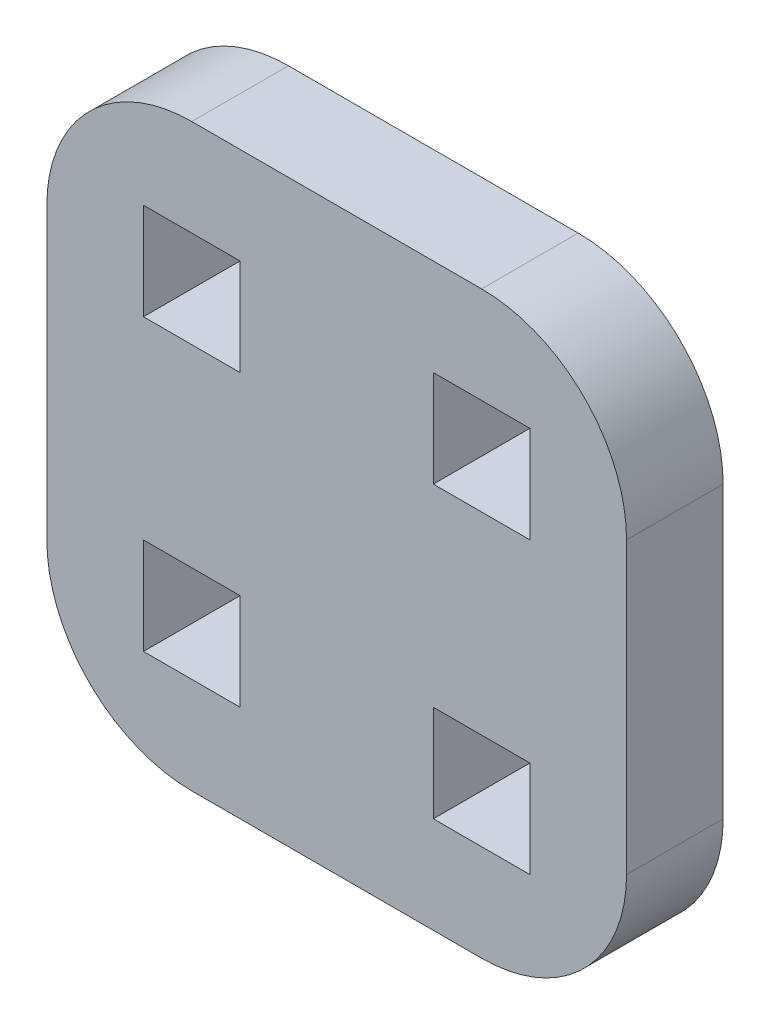
ISO-10303-21;
HEADER;
FILE_DESCRIPTION(('STEP AP214'),'2;1');
FILE_NAME('part.step','',(''),(''),'','','');
FILE_SCHEMA(('AUTOMOTIVE_DESIGN { 1 0 10303 214 1 1 1 1 }'));
ENDSEC;
DATA;
#1=APPLICATION_CONTEXT('core data for automotive mechanical design processes');
#2=APPLICATION_PROTOCOL_DEFINITION('international standard','automotive_design',2000,#1);
#3=PRODUCT_CONTEXT('',#1,'mechanical');
#4=PRODUCT('Part','Part','',(#3));
#5=PRODUCT_RELATED_PRODUCT_CATEGORY('part','',(#4));
#6=PRODUCT_DEFINITION_FORMATION('','',#4);
#7=PRODUCT_DEFINITION_CONTEXT('part definition',#1,'design');
#8=PRODUCT_DEFINITION('design','',#6,#7);
#9=PRODUCT_DEFINITION_SHAPE('','',#8);
#10=(LENGTH_UNIT() NAMED_UNIT(*) SI_UNIT(.MILLI.,.METRE.));
#11=(NAMED_UNIT(*) PLANE_ANGLE_UNIT() SI_UNIT($,.RADIAN.));
#12=(NAMED_UNIT(*) SI_UNIT($,.STERADIAN.) SOLID_ANGLE_UNIT());
#13=UNCERTAINTY_MEASURE_WITH_UNIT(LENGTH_MEASURE(1.E-05),#10,'distance_accuracy_value','');
#14=(GEOMETRIC_REPRESENTATION_CONTEXT(3) GLOBAL_UNCERTAINTY_ASSIGNED_CONTEXT((#13)) GLOBAL_UNIT_ASSIGNED_CONTEXT((#10,
#11,#12)) REPRESENTATION_CONTEXT('',''));
#15=CARTESIAN_POINT('',(0.,0.,0.));
#16=DIRECTION('',(0.,0.,1.));
#17=DIRECTION('',(1.,0.,0.));
#18=AXIS2_PLACEMENT_3D('',#15,#16,#17);
#19=CARTESIAN_POINT('',(18.821574141,295.0404470336,3.));
#20=DIRECTION('',(0.,0.,1.));
#21=DIRECTION('',(1.,0.,0.));
#22=AXIS2_PLACEMENT_3D('',#19,#20,#21);
#23=PLANE('',#22);
#24=DIRECTION('',(0.,-1.,0.));
#25=VECTOR('',#24,1.);
#26=CARTESIAN_POINT('',(8.321574141,287.5404470336,3.));
#27=LINE('',#26,#25);
#28=CARTESIAN_POINT('',(8.321574141,287.5404470336,3.));
#29=VERTEX_POINT('',#28);
#30=CARTESIAN_POINT('',(8.321574141,284.5404470336,3.));
#31=VERTEX_POINT('',#30);
#32=EDGE_CURVE('E232',#29,#31,#27,.T.);
#33=ORIENTED_EDGE('',*,*,#32,.F.);
#34=DIRECTION('',(-1.,0.,0.));
#35=VECTOR('',#34,1.);
#36=CARTESIAN_POINT('',(11.321574141,287.5404470336,3.));
#37=LINE('',#36,#35);
#38=CARTESIAN_POINT('',(11.321574141,287.5404470336,3.));
#39=VERTEX_POINT('',#38);
#40=EDGE_CURVE('E230',#39,#29,#37,.T.);
#41=ORIENTED_EDGE('',*,*,#40,.F.);
#42=DIRECTION('',(0.,1.,0.));
#43=VECTOR('',#42,1.);
#44=CARTESIAN_POINT('',(11.321574141,284.5404470336,3.));
#45=LINE('',#44,#43);
#46=CARTESIAN_POINT('',(11.321574141,284.5404470336,3.));
#47=VERTEX_POINT('',#46);
#48=EDGE_CURVE('E238',#47,#39,#45,.T.);
#49=ORIENTED_EDGE('',*,*,#48,.F.);
#50=DIRECTION('',(1.,0.,0.));
#51=VECTOR('',#50,1.);
#52=CARTESIAN_POINT('',(8.321574141,284.5404470336,3.));
#53=LINE('',#52,#51);
#54=EDGE_CURVE('E235',#31,#47,#53,.T.);
#55=ORIENTED_EDGE('',*,*,#54,.F.);
#56=EDGE_LOOP('',(#33,#41,#49,#55));
#57=FACE_BOUND('',#56,.T.);
#58=DIRECTION('',(0.,-1.,0.));
#59=VECTOR('',#58,1.);
#60=CARTESIAN_POINT('',(8.321574141,296.5404470336,3.));
#61=LINE('',#60,#59);
#62=CARTESIAN_POINT('',(8.321574141,296.5404470336,3.));
#63=VERTEX_POINT('',#62);
#64=CARTESIAN_POINT('',(8.321574141,293.5404470336,3.));
#65=VERTEX_POINT('',#64);
#66=EDGE_CURVE('E294',#63,#65,#61,.T.);
#67=ORIENTED_EDGE('',*,*,#66,.F.);
#68=DIRECTION('',(-1.,0.,0.));
#69=VECTOR('',#68,1.);
#70=CARTESIAN_POINT('',(11.321574141,296.5404470336,3.));
#71=LINE('',#70,#69);
#72=CARTESIAN_POINT('',(11.321574141,296.5404470336,3.));
#73=VERTEX_POINT('',#72);
#74=EDGE_CURVE('E292',#73,#63,#71,.T.);
#75=ORIENTED_EDGE('',*,*,#74,.F.);
#76=DIRECTION('',(0.,1.,0.));
#77=VECTOR('',#76,1.);
#78=CARTESIAN_POINT('',(11.321574141,293.5404470336,3.));
#79=LINE('',#78,#77);
#80=CARTESIAN_POINT('',(11.321574141,293.5404470336,3.));
#81=VERTEX_POINT('',#80);
#82=EDGE_CURVE('E300',#81,#73,#79,.T.);
#83=ORIENTED_EDGE('',*,*,#82,.F.);
#84=DIRECTION('',(1.,0.,0.));
#85=VECTOR('',#84,1.);
#86=CARTESIAN_POINT('',(8.321574141,293.5404470336,3.));
#87=LINE('',#86,#85);
#88=EDGE_CURVE('E297',#65,#81,#87,.T.);
#89=ORIENTED_EDGE('',*,*,#88,.F.);
#90=EDGE_LOOP('',(#67,#75,#83,#89));
#91=FACE_BOUND('',#90,.T.);
#92=CARTESIAN_POINT('',(18.821574141,295.0404470336,3.));
#93=DIRECTION('',(0.,0.,1.));
#94=DIRECTION('',(1.,0.,0.));
#95=AXIS2_PLACEMENT_3D('',#92,#93,#94);
#96=CIRCLE('',#95,4.5);
#97=CARTESIAN_POINT('',(23.321574141,295.0404470336,3.));
#98=VERTEX_POINT('',#97);
#99=CARTESIAN_POINT('',(18.821574141,299.5404470336,3.));
#100=VERTEX_POINT('',#99);
#101=EDGE_CURVE('E323',#98,#100,#96,.T.);
#102=ORIENTED_EDGE('',*,*,#101,.T.);
#103=DIRECTION('',(-1.,0.,0.));
#104=VECTOR('',#103,1.);
#105=CARTESIAN_POINT('',(9.821574141,299.5404470336,3.));
#106=LINE('',#105,#104);
#107=CARTESIAN_POINT('',(9.821574141,299.5404470336,3.));
#108=VERTEX_POINT('',#107);
#109=EDGE_CURVE('E326',#100,#108,#106,.T.);
#110=ORIENTED_EDGE('',*,*,#109,.T.);
#111=CARTESIAN_POINT('',(9.821574141,295.0404470336,3.));
#112=DIRECTION('',(0.,0.,1.));
#113=DIRECTION('',(1.,0.,0.));
#114=AXIS2_PLACEMENT_3D('',#111,#112,#113);
#115=CIRCLE('',#114,4.5);
#116=CARTESIAN_POINT('',(5.321574141,295.0404470336,3.));
#117=VERTEX_POINT('',#116);
#118=EDGE_CURVE('E329',#108,#117,#115,.T.);
#119=ORIENTED_EDGE('',*,*,#118,.T.);
#120=DIRECTION('',(0.,-1.,0.));
#121=VECTOR('',#120,1.);
#122=CARTESIAN_POINT('',(5.321574141,295.0404470336,3.));
#123=LINE('',#122,#121);
#124=CARTESIAN_POINT('',(5.321574141,286.0404470336,3.));
#125=VERTEX_POINT('',#124);
#126=EDGE_CURVE('E331',#117,#125,#123,.T.);
#127=ORIENTED_EDGE('',*,*,#126,.T.);
#128=CARTESIAN_POINT('',(9.821574141,286.0404470336,3.));
#129=DIRECTION('',(0.,0.,1.));
#130=DIRECTION('',(1.,0.,0.));
#131=AXIS2_PLACEMENT_3D('',#128,#129,#130);
#132=CIRCLE('',#131,4.5);
#133=CARTESIAN_POINT('',(9.821574141,281.5404470336,3.));
#134=VERTEX_POINT('',#133);
#135=EDGE_CURVE('E333',#125,#134,#132,.T.);
#136=ORIENTED_EDGE('',*,*,#135,.T.);
#137=DIRECTION('',(1.,0.,0.));
#138=VECTOR('',#137,1.);
#139=CARTESIAN_POINT('',(9.821574141,281.5404470336,3.));
#140=LINE('',#139,#138);
#141=CARTESIAN_POINT('',(18.821574141,281.5404470336,3.));
#142=VERTEX_POINT('',#141);
#143=EDGE_CURVE('E335',#134,#142,#140,.T.);
#144=ORIENTED_EDGE('',*,*,#143,.T.);
#145=CARTESIAN_POINT('',(18.821574141,286.0404470336,3.));
#146=DIRECTION('',(0.,0.,1.));
#147=DIRECTION('',(1.,0.,0.));
#148=AXIS2_PLACEMENT_3D('',#145,#146,#147);
#149=CIRCLE('',#148,4.5);
#150=CARTESIAN_POINT('',(23.321574141,286.0404470336,3.));
#151=VERTEX_POINT('',#150);
#152=EDGE_CURVE('E337',#142,#151,#149,.T.);
#153=ORIENTED_EDGE('',*,*,#152,.T.);
#154=DIRECTION('',(0.,1.,0.));
#155=VECTOR('',#154,1.);
#156=CARTESIAN_POINT('',(23.321574141,295.0404470336,3.));
#157=LINE('',#156,#155);
#158=EDGE_CURVE('E339',#151,#98,#157,.T.);
#159=ORIENTED_EDGE('',*,*,#158,.T.);
#160=EDGE_LOOP('',(#102,#110,#119,#127,#136,#144,#153,#159));
#161=FACE_BOUND('',#160,.T.);
#162=DIRECTION('',(0.,-1.,0.));
#163=VECTOR('',#162,1.);
#164=CARTESIAN_POINT('',(17.321574141,296.5404470336,3.));
#165=LINE('',#164,#163);
#166=CARTESIAN_POINT('',(17.321574141,296.5404470336,3.));
#167=VERTEX_POINT('',#166);
#168=CARTESIAN_POINT('',(17.321574141,293.5404470336,3.));
#169=VERTEX_POINT('',#168);
#170=EDGE_CURVE('E263',#167,#169,#165,.T.);
#171=ORIENTED_EDGE('',*,*,#170,.F.);
#172=DIRECTION('',(-1.,0.,0.));
#173=VECTOR('',#172,1.);
#174=CARTESIAN_POINT('',(20.321574141,296.5404470336,3.));
#175=LINE('',#174,#173);
#176=CARTESIAN_POINT('',(20.321574141,296.5404470336,3.));
#177=VERTEX_POINT('',#176);
#178=EDGE_CURVE('E261',#177,#167,#175,.T.);
#179=ORIENTED_EDGE('',*,*,#178,.F.);
#180=DIRECTION('',(0.,1.,0.));
#181=VECTOR('',#180,1.);
#182=CARTESIAN_POINT('',(20.321574141,293.5404470336,3.));
#183=LINE('',#182,#181);
#184=CARTESIAN_POINT('',(20.321574141,293.5404470336,3.));
#185=VERTEX_POINT('',#184);
#186=EDGE_CURVE('E269',#185,#177,#183,.T.);
#187=ORIENTED_EDGE('',*,*,#186,.F.);
#188=DIRECTION('',(1.,0.,0.));
#189=VECTOR('',#188,1.);
#190=CARTESIAN_POINT('',(17.321574141,293.5404470336,3.));
#191=LINE('',#190,#189);
#192=EDGE_CURVE('E266',#169,#185,#191,.T.);
#193=ORIENTED_EDGE('',*,*,#192,.F.);
#194=EDGE_LOOP('',(#171,#179,#187,#193));
#195=FACE_BOUND('',#194,.T.);
#196=DIRECTION('',(0.,-1.,0.));
#197=VECTOR('',#196,1.);
#198=CARTESIAN_POINT('',(17.321574141,287.5404470336,3.));
#199=LINE('',#198,#197);
#200=CARTESIAN_POINT('',(17.321574141,287.5404470336,3.));
#201=VERTEX_POINT('',#200);
#202=CARTESIAN_POINT('',(17.321574141,284.5404470336,3.));
#203=VERTEX_POINT('',#202);
#204=EDGE_CURVE('E202',#201,#203,#199,.T.);
#205=ORIENTED_EDGE('',*,*,#204,.F.);
#206=DIRECTION('',(-1.,0.,0.));
#207=VECTOR('',#206,1.);
#208=CARTESIAN_POINT('',(20.321574141,287.5404470336,3.));
#209=LINE('',#208,#207);
#210=CARTESIAN_POINT('',(20.321574141,287.5404470336,3.));
#211=VERTEX_POINT('',#210);
#212=EDGE_CURVE('E194',#211,#201,#209,.T.);
#213=ORIENTED_EDGE('',*,*,#212,.F.);
#214=DIRECTION('',(0.,1.,0.));
#215=VECTOR('',#214,1.);
#216=CARTESIAN_POINT('',(20.321574141,284.5404470336,3.));
#217=LINE('',#216,#215);
#218=CARTESIAN_POINT('',(20.321574141,284.5404470336,3.));
#219=VERTEX_POINT('',#218);
#220=EDGE_CURVE('E216',#219,#211,#217,.T.);
#221=ORIENTED_EDGE('',*,*,#220,.F.);
#222=DIRECTION('',(1.,0.,0.));
#223=VECTOR('',#222,1.);
#224=CARTESIAN_POINT('',(17.321574141,284.5404470336,3.));
#225=LINE('',#224,#223);
#226=EDGE_CURVE('E214',#203,#219,#225,.T.);
#227=ORIENTED_EDGE('',*,*,#226,.F.);
#228=EDGE_LOOP('',(#205,#213,#221,#227));
#229=FACE_BOUND('',#228,.T.);
#230=ADVANCED_FACE('F33',(#57,#91,#161,#195,#229),#23,.T.);
#231=CARTESIAN_POINT('',(18.821574141,295.0404470336,0.));
#232=DIRECTION('',(0.,0.,1.));
#233=DIRECTION('',(1.,0.,0.));
#234=AXIS2_PLACEMENT_3D('',#231,#232,#233);
#235=PLANE('',#234);
#236=DIRECTION('',(-1.,0.,0.));
#237=VECTOR('',#236,1.);
#238=CARTESIAN_POINT('',(11.321574141,287.5404470336,0.));
#239=LINE('',#238,#237);
#240=CARTESIAN_POINT('',(11.321574141,287.5404470336,0.));
#241=VERTEX_POINT('',#240);
#242=CARTESIAN_POINT('',(8.321574141,287.5404470336,0.));
#243=VERTEX_POINT('',#242);
#244=EDGE_CURVE('E210',#241,#243,#239,.T.);
#245=ORIENTED_EDGE('',*,*,#244,.T.);
#246=DIRECTION('',(0.,-1.,0.));
#247=VECTOR('',#246,1.);
#248=CARTESIAN_POINT('',(8.321574141,287.5404470336,0.));
#249=LINE('',#248,#247);
#250=CARTESIAN_POINT('',(8.321574141,284.5404470336,0.));
#251=VERTEX_POINT('',#250);
#252=EDGE_CURVE('E243',#243,#251,#249,.T.);
#253=ORIENTED_EDGE('',*,*,#252,.T.);
#254=DIRECTION('',(1.,0.,0.));
#255=VECTOR('',#254,1.);
#256=CARTESIAN_POINT('',(8.321574141,284.5404470336,0.));
#257=LINE('',#256,#255);
#258=CARTESIAN_POINT('',(11.321574141,284.5404470336,0.));
#259=VERTEX_POINT('',#258);
#260=EDGE_CURVE('E246',#251,#259,#257,.T.);
#261=ORIENTED_EDGE('',*,*,#260,.T.);
#262=DIRECTION('',(0.,1.,0.));
#263=VECTOR('',#262,1.);
#264=CARTESIAN_POINT('',(11.321574141,284.5404470336,0.));
#265=LINE('',#264,#263);
#266=EDGE_CURVE('E233',#259,#241,#265,.T.);
#267=ORIENTED_EDGE('',*,*,#266,.T.);
#268=EDGE_LOOP('',(#245,#253,#261,#267));
#269=FACE_BOUND('',#268,.T.);
#270=DIRECTION('',(-1.,0.,0.));
#271=VECTOR('',#270,1.);
#272=CARTESIAN_POINT('',(11.321574141,296.5404470336,0.));
#273=LINE('',#272,#271);
#274=CARTESIAN_POINT('',(11.321574141,296.5404470336,0.));
#275=VERTEX_POINT('',#274);
#276=CARTESIAN_POINT('',(8.321574141,296.5404470336,0.));
#277=VERTEX_POINT('',#276);
#278=EDGE_CURVE('E291',#275,#277,#273,.T.);
#279=ORIENTED_EDGE('',*,*,#278,.T.);
#280=DIRECTION('',(0.,-1.,0.));
#281=VECTOR('',#280,1.);
#282=CARTESIAN_POINT('',(8.321574141,296.5404470336,0.));
#283=LINE('',#282,#281);
#284=CARTESIAN_POINT('',(8.321574141,293.5404470336,0.));
#285=VERTEX_POINT('',#284);
#286=EDGE_CURVE('E305',#277,#285,#283,.T.);
#287=ORIENTED_EDGE('',*,*,#286,.T.);
#288=DIRECTION('',(1.,0.,0.));
#289=VECTOR('',#288,1.);
#290=CARTESIAN_POINT('',(8.321574141,293.5404470336,0.));
#291=LINE('',#290,#289);
#292=CARTESIAN_POINT('',(11.321574141,293.5404470336,0.));
#293=VERTEX_POINT('',#292);
#294=EDGE_CURVE('E308',#285,#293,#291,.T.);
#295=ORIENTED_EDGE('',*,*,#294,.T.);
#296=DIRECTION('',(0.,1.,0.));
#297=VECTOR('',#296,1.);
#298=CARTESIAN_POINT('',(11.321574141,293.5404470336,0.));
#299=LINE('',#298,#297);
#300=EDGE_CURVE('E295',#293,#275,#299,.T.);
#301=ORIENTED_EDGE('',*,*,#300,.T.);
#302=EDGE_LOOP('',(#279,#287,#295,#301));
#303=FACE_BOUND('',#302,.T.);
#304=CARTESIAN_POINT('',(18.821574141,295.0404470336,0.));
#305=DIRECTION('',(0.,0.,1.));
#306=DIRECTION('',(1.,0.,0.));
#307=AXIS2_PLACEMENT_3D('',#304,#305,#306);
#308=CIRCLE('',#307,4.5);
#309=CARTESIAN_POINT('',(23.321574141,295.0404470336,0.));
#310=VERTEX_POINT('',#309);
#311=CARTESIAN_POINT('',(18.821574141,299.5404470336,0.));
#312=VERTEX_POINT('',#311);
#313=EDGE_CURVE('E322',#310,#312,#308,.T.);
#314=ORIENTED_EDGE('',*,*,#313,.F.);
#315=DIRECTION('',(0.,1.,0.));
#316=VECTOR('',#315,1.);
#317=CARTESIAN_POINT('',(23.321574141,295.0404470336,0.));
#318=LINE('',#317,#316);
#319=CARTESIAN_POINT('',(23.321574141,286.0404470336,0.));
#320=VERTEX_POINT('',#319);
#321=EDGE_CURVE('E327',#320,#310,#318,.T.);
#322=ORIENTED_EDGE('',*,*,#321,.F.);
#323=CARTESIAN_POINT('',(18.821574141,286.0404470336,0.));
#324=DIRECTION('',(0.,0.,1.));
#325=DIRECTION('',(1.,0.,0.));
#326=AXIS2_PLACEMENT_3D('',#323,#324,#325);
#327=CIRCLE('',#326,4.5);
#328=CARTESIAN_POINT('',(18.821574141,281.5404470336,0.));
#329=VERTEX_POINT('',#328);
#330=EDGE_CURVE('E354',#329,#320,#327,.T.);
#331=ORIENTED_EDGE('',*,*,#330,.F.);
#332=DIRECTION('',(1.,0.,0.));
#333=VECTOR('',#332,1.);
#334=CARTESIAN_POINT('',(9.821574141,281.5404470336,0.));
#335=LINE('',#334,#333);
#336=CARTESIAN_POINT('',(9.821574141,281.5404470336,0.));
#337=VERTEX_POINT('',#336);
#338=EDGE_CURVE('E352',#337,#329,#335,.T.);
#339=ORIENTED_EDGE('',*,*,#338,.F.);
#340=CARTESIAN_POINT('',(9.821574141,286.0404470336,0.));
#341=DIRECTION('',(0.,0.,1.));
#342=DIRECTION('',(1.,0.,0.));
#343=AXIS2_PLACEMENT_3D('',#340,#341,#342);
#344=CIRCLE('',#343,4.5);
#345=CARTESIAN_POINT('',(5.321574141,286.0404470336,0.));
#346=VERTEX_POINT('',#345);
#347=EDGE_CURVE('E350',#346,#337,#344,.T.);
#348=ORIENTED_EDGE('',*,*,#347,.F.);
#349=DIRECTION('',(0.,-1.,0.));
#350=VECTOR('',#349,1.);
#351=CARTESIAN_POINT('',(5.321574141,295.0404470336,0.));
#352=LINE('',#351,#350);
#353=CARTESIAN_POINT('',(5.321574141,295.0404470336,0.));
#354=VERTEX_POINT('',#353);
#355=EDGE_CURVE('E348',#354,#346,#352,.T.);
#356=ORIENTED_EDGE('',*,*,#355,.F.);
#357=CARTESIAN_POINT('',(9.821574141,295.0404470336,0.));
#358=DIRECTION('',(0.,0.,1.));
#359=DIRECTION('',(1.,0.,0.));
#360=AXIS2_PLACEMENT_3D('',#357,#358,#359);
#361=CIRCLE('',#360,4.5);
#362=CARTESIAN_POINT('',(9.821574141,299.5404470336,0.));
#363=VERTEX_POINT('',#362);
#364=EDGE_CURVE('E346',#363,#354,#361,.T.);
#365=ORIENTED_EDGE('',*,*,#364,.F.);
#366=DIRECTION('',(-1.,0.,0.));
#367=VECTOR('',#366,1.);
#368=CARTESIAN_POINT('',(9.821574141,299.5404470336,0.));
#369=LINE('',#368,#367);
#370=EDGE_CURVE('E344',#312,#363,#369,.T.);
#371=ORIENTED_EDGE('',*,*,#370,.F.);
#372=EDGE_LOOP('',(#314,#322,#331,#339,#348,#356,#365,#371));
#373=FACE_BOUND('',#372,.T.);
#374=DIRECTION('',(-1.,0.,0.));
#375=VECTOR('',#374,1.);
#376=CARTESIAN_POINT('',(20.321574141,296.5404470336,0.));
#377=LINE('',#376,#375);
#378=CARTESIAN_POINT('',(20.321574141,296.5404470336,0.));
#379=VERTEX_POINT('',#378);
#380=CARTESIAN_POINT('',(17.321574141,296.5404470336,0.));
#381=VERTEX_POINT('',#380);
#382=EDGE_CURVE('E260',#379,#381,#377,.T.);
#383=ORIENTED_EDGE('',*,*,#382,.T.);
#384=DIRECTION('',(0.,-1.,0.));
#385=VECTOR('',#384,1.);
#386=CARTESIAN_POINT('',(17.321574141,296.5404470336,0.));
#387=LINE('',#386,#385);
#388=CARTESIAN_POINT('',(17.321574141,293.5404470336,0.));
#389=VERTEX_POINT('',#388);
#390=EDGE_CURVE('E274',#381,#389,#387,.T.);
#391=ORIENTED_EDGE('',*,*,#390,.T.);
#392=DIRECTION('',(1.,0.,0.));
#393=VECTOR('',#392,1.);
#394=CARTESIAN_POINT('',(17.321574141,293.5404470336,0.));
#395=LINE('',#394,#393);
#396=CARTESIAN_POINT('',(20.321574141,293.5404470336,0.));
#397=VERTEX_POINT('',#396);
#398=EDGE_CURVE('E277',#389,#397,#395,.T.);
#399=ORIENTED_EDGE('',*,*,#398,.T.);
#400=DIRECTION('',(0.,1.,0.));
#401=VECTOR('',#400,1.);
#402=CARTESIAN_POINT('',(20.321574141,293.5404470336,0.));
#403=LINE('',#402,#401);
#404=EDGE_CURVE('E264',#397,#379,#403,.T.);
#405=ORIENTED_EDGE('',*,*,#404,.T.);
#406=EDGE_LOOP('',(#383,#391,#399,#405));
#407=FACE_BOUND('',#406,.T.);
#408=DIRECTION('',(-1.,0.,0.));
#409=VECTOR('',#408,1.);
#410=CARTESIAN_POINT('',(20.321574141,287.5404470336,0.));
#411=LINE('',#410,#409);
#412=CARTESIAN_POINT('',(20.321574141,287.5404470336,0.));
#413=VERTEX_POINT('',#412);
#414=CARTESIAN_POINT('',(17.321574141,287.5404470336,0.));
#415=VERTEX_POINT('',#414);
#416=EDGE_CURVE('E56',#413,#415,#411,.T.);
#417=ORIENTED_EDGE('',*,*,#416,.T.);
#418=DIRECTION('',(0.,-1.,0.));
#419=VECTOR('',#418,1.);
#420=CARTESIAN_POINT('',(17.321574141,287.5404470336,0.));
#421=LINE('',#420,#419);
#422=CARTESIAN_POINT('',(17.321574141,284.5404470336,0.));
#423=VERTEX_POINT('',#422);
#424=EDGE_CURVE('E209',#415,#423,#421,.T.);
#425=ORIENTED_EDGE('',*,*,#424,.T.);
#426=DIRECTION('',(1.,0.,0.));
#427=VECTOR('',#426,1.);
#428=CARTESIAN_POINT('',(17.321574141,284.5404470336,0.));
#429=LINE('',#428,#427);
#430=CARTESIAN_POINT('',(20.321574141,284.5404470336,0.));
#431=VERTEX_POINT('',#430);
#432=EDGE_CURVE('E222',#423,#431,#429,.T.);
#433=ORIENTED_EDGE('',*,*,#432,.T.);
#434=DIRECTION('',(0.,1.,0.));
#435=VECTOR('',#434,1.);
#436=CARTESIAN_POINT('',(20.321574141,284.5404470336,0.));
#437=LINE('',#436,#435);
#438=EDGE_CURVE('E203',#431,#413,#437,.T.);
#439=ORIENTED_EDGE('',*,*,#438,.T.);
#440=EDGE_LOOP('',(#417,#425,#433,#439));
#441=FACE_BOUND('',#440,.T.);
#442=ADVANCED_FACE('F384',(#269,#303,#373,#407,#441),#235,.F.);
#443=CARTESIAN_POINT('',(18.821574141,295.0404470336,3.));
#444=DIRECTION('',(0.,0.,-1.));
#445=DIRECTION('',(-1.,0.,0.));
#446=AXIS2_PLACEMENT_3D('',#443,#444,#445);
#447=CYLINDRICAL_SURFACE('',#446,4.5);
#448=ORIENTED_EDGE('',*,*,#313,.T.);
#449=DIRECTION('',(0.,0.,-1.));
#450=VECTOR('',#449,1.);
#451=CARTESIAN_POINT('',(18.821574141,299.5404470336,3.));
#452=LINE('',#451,#450);
#453=EDGE_CURVE('E11',#100,#312,#452,.T.);
#454=ORIENTED_EDGE('',*,*,#453,.F.);
#455=ORIENTED_EDGE('',*,*,#101,.F.);
#456=DIRECTION('',(0.,0.,-1.));
#457=VECTOR('',#456,1.);
#458=CARTESIAN_POINT('',(23.321574141,295.0404470336,3.));
#459=LINE('',#458,#457);
#460=EDGE_CURVE('E341',#98,#310,#459,.T.);
#461=ORIENTED_EDGE('',*,*,#460,.T.);
#462=EDGE_LOOP('',(#448,#454,#455,#461));
#463=FACE_BOUND('',#462,.T.);
#464=ADVANCED_FACE('F35',(#463),#447,.T.);
#465=CARTESIAN_POINT('',(9.821574141,299.5404470336,3.));
#466=DIRECTION('',(0.,-1.,0.));
#467=DIRECTION('',(0.,0.,-1.));
#468=AXIS2_PLACEMENT_3D('',#465,#466,#467);
#469=PLANE('',#468);
#470=ORIENTED_EDGE('',*,*,#370,.T.);
#471=DIRECTION('',(0.,0.,-1.));
#472=VECTOR('',#471,1.);
#473=CARTESIAN_POINT('',(9.821574141,299.5404470336,3.));
#474=LINE('',#473,#472);
#475=EDGE_CURVE('E41',#108,#363,#474,.T.);
#476=ORIENTED_EDGE('',*,*,#475,.F.);
#477=ORIENTED_EDGE('',*,*,#109,.F.);
#478=ORIENTED_EDGE('',*,*,#453,.T.);
#479=EDGE_LOOP('',(#470,#476,#477,#478));
#480=FACE_BOUND('',#479,.T.);
#481=ADVANCED_FACE('F402',(#480),#469,.F.);
#482=CARTESIAN_POINT('',(9.821574141,295.0404470336,3.));
#483=DIRECTION('',(0.,0.,-1.));
#484=DIRECTION('',(-1.,0.,0.));
#485=AXIS2_PLACEMENT_3D('',#482,#483,#484);
#486=CYLINDRICAL_SURFACE('',#485,4.5);
#487=ORIENTED_EDGE('',*,*,#364,.T.);
#488=DIRECTION('',(0.,0.,-1.));
#489=VECTOR('',#488,1.);
#490=CARTESIAN_POINT('',(5.321574141,295.0404470336,3.));
#491=LINE('',#490,#489);
#492=EDGE_CURVE('E371',#117,#354,#491,.T.);
#493=ORIENTED_EDGE('',*,*,#492,.F.);
#494=ORIENTED_EDGE('',*,*,#118,.F.);
#495=ORIENTED_EDGE('',*,*,#475,.T.);
#496=EDGE_LOOP('',(#487,#493,#494,#495));
#497=FACE_BOUND('',#496,.T.);
#498=ADVANCED_FACE('F378',(#497),#486,.T.);
#499=CARTESIAN_POINT('',(5.321574141,295.0404470336,3.));
#500=DIRECTION('',(1.,0.,0.));
#501=DIRECTION('',(0.,0.,-1.));
#502=AXIS2_PLACEMENT_3D('',#499,#500,#501);
#503=PLANE('',#502);
#504=ORIENTED_EDGE('',*,*,#355,.T.);
#505=DIRECTION('',(0.,0.,-1.));
#506=VECTOR('',#505,1.);
#507=CARTESIAN_POINT('',(5.321574141,286.0404470336,3.));
#508=LINE('',#507,#506);
#509=EDGE_CURVE('E368',#125,#346,#508,.T.);
#510=ORIENTED_EDGE('',*,*,#509,.F.);
#511=ORIENTED_EDGE('',*,*,#126,.F.);
#512=ORIENTED_EDGE('',*,*,#492,.T.);
#513=EDGE_LOOP('',(#504,#510,#511,#512));
#514=FACE_BOUND('',#513,.T.);
#515=ADVANCED_FACE('F390',(#514),#503,.F.);
#516=CARTESIAN_POINT('',(9.821574141,286.0404470336,3.));
#517=DIRECTION('',(0.,0.,-1.));
#518=DIRECTION('',(-1.,0.,0.));
#519=AXIS2_PLACEMENT_3D('',#516,#517,#518);
#520=CYLINDRICAL_SURFACE('',#519,4.5);
#521=ORIENTED_EDGE('',*,*,#347,.T.);
#522=DIRECTION('',(0.,0.,-1.));
#523=VECTOR('',#522,1.);
#524=CARTESIAN_POINT('',(9.821574141,281.5404470336,3.));
#525=LINE('',#524,#523);
#526=EDGE_CURVE('E365',#134,#337,#525,.T.);
#527=ORIENTED_EDGE('',*,*,#526,.F.);
#528=ORIENTED_EDGE('',*,*,#135,.F.);
#529=ORIENTED_EDGE('',*,*,#509,.T.);
#530=EDGE_LOOP('',(#521,#527,#528,#529));
#531=FACE_BOUND('',#530,.T.);
#532=ADVANCED_FACE('F394',(#531),#520,.T.);
#533=CARTESIAN_POINT('',(9.821574141,281.5404470336,3.));
#534=DIRECTION('',(0.,1.,0.));
#535=DIRECTION('',(0.,0.,1.));
#536=AXIS2_PLACEMENT_3D('',#533,#534,#535);
#537=PLANE('',#536);
#538=ORIENTED_EDGE('',*,*,#338,.T.);
#539=DIRECTION('',(0.,0.,-1.));
#540=VECTOR('',#539,1.);
#541=CARTESIAN_POINT('',(18.821574141,281.5404470336,3.));
#542=LINE('',#541,#540);
#543=EDGE_CURVE('E362',#142,#329,#542,.T.);
#544=ORIENTED_EDGE('',*,*,#543,.F.);
#545=ORIENTED_EDGE('',*,*,#143,.F.);
#546=ORIENTED_EDGE('',*,*,#526,.T.);
#547=EDGE_LOOP('',(#538,#544,#545,#546));
#548=FACE_BOUND('',#547,.T.);
#549=ADVANCED_FACE('F415',(#548),#537,.F.);
#550=CARTESIAN_POINT('',(18.821574141,286.0404470336,3.));
#551=DIRECTION('',(0.,0.,-1.));
#552=DIRECTION('',(-1.,0.,0.));
#553=AXIS2_PLACEMENT_3D('',#550,#551,#552);
#554=CYLINDRICAL_SURFACE('',#553,4.5);
#555=ORIENTED_EDGE('',*,*,#330,.T.);
#556=DIRECTION('',(0.,0.,-1.));
#557=VECTOR('',#556,1.);
#558=CARTESIAN_POINT('',(23.321574141,286.0404470336,3.));
#559=LINE('',#558,#557);
#560=EDGE_CURVE('E359',#151,#320,#559,.T.);
#561=ORIENTED_EDGE('',*,*,#560,.F.);
#562=ORIENTED_EDGE('',*,*,#152,.F.);
#563=ORIENTED_EDGE('',*,*,#543,.T.);
#564=EDGE_LOOP('',(#555,#561,#562,#563));
#565=FACE_BOUND('',#564,.T.);
#566=ADVANCED_FACE('F413',(#565),#554,.T.);
#567=CARTESIAN_POINT('',(23.321574141,295.0404470336,3.));
#568=DIRECTION('',(-1.,0.,0.));
#569=DIRECTION('',(0.,0.,1.));
#570=AXIS2_PLACEMENT_3D('',#567,#568,#569);
#571=PLANE('',#570);
#572=ORIENTED_EDGE('',*,*,#321,.T.);
#573=ORIENTED_EDGE('',*,*,#460,.F.);
#574=ORIENTED_EDGE('',*,*,#158,.F.);
#575=ORIENTED_EDGE('',*,*,#560,.T.);
#576=EDGE_LOOP('',(#572,#573,#574,#575));
#577=FACE_BOUND('',#576,.T.);
#578=ADVANCED_FACE('F408',(#577),#571,.F.);
#579=CARTESIAN_POINT('',(11.321574141,296.5404470336,3.));
#580=DIRECTION('',(0.,-1.,0.));
#581=DIRECTION('',(0.,0.,-1.));
#582=AXIS2_PLACEMENT_3D('',#579,#580,#581);
#583=PLANE('',#582);
#584=ORIENTED_EDGE('',*,*,#278,.F.);
#585=DIRECTION('',(0.,0.,-1.));
#586=VECTOR('',#585,1.);
#587=CARTESIAN_POINT('',(11.321574141,296.5404470336,3.));
#588=LINE('',#587,#586);
#589=EDGE_CURVE('E302',#73,#275,#588,.T.);
#590=ORIENTED_EDGE('',*,*,#589,.F.);
#591=ORIENTED_EDGE('',*,*,#74,.T.);
#592=DIRECTION('',(0.,0.,-1.));
#593=VECTOR('',#592,1.);
#594=CARTESIAN_POINT('',(8.321574141,296.5404470336,3.));
#595=LINE('',#594,#593);
#596=EDGE_CURVE('E319',#63,#277,#595,.T.);
#597=ORIENTED_EDGE('',*,*,#596,.T.);
#598=EDGE_LOOP('',(#584,#590,#591,#597));
#599=FACE_BOUND('',#598,.T.);
#600=ADVANCED_FACE('F435',(#599),#583,.T.);
#601=CARTESIAN_POINT('',(8.321574141,296.5404470336,3.));
#602=DIRECTION('',(1.,0.,0.));
#603=DIRECTION('',(0.,0.,-1.));
#604=AXIS2_PLACEMENT_3D('',#601,#602,#603);
#605=PLANE('',#604);
#606=ORIENTED_EDGE('',*,*,#286,.F.);
#607=ORIENTED_EDGE('',*,*,#596,.F.);
#608=ORIENTED_EDGE('',*,*,#66,.T.);
#609=DIRECTION('',(0.,0.,-1.));
#610=VECTOR('',#609,1.);
#611=CARTESIAN_POINT('',(8.321574141,293.5404470336,3.));
#612=LINE('',#611,#610);
#613=EDGE_CURVE('E317',#65,#285,#612,.T.);
#614=ORIENTED_EDGE('',*,*,#613,.T.);
#615=EDGE_LOOP('',(#606,#607,#608,#614));
#616=FACE_BOUND('',#615,.T.);
#617=ADVANCED_FACE('F442',(#616),#605,.T.);
#618=CARTESIAN_POINT('',(8.321574141,293.5404470336,3.));
#619=DIRECTION('',(0.,1.,0.));
#620=DIRECTION('',(0.,0.,1.));
#621=AXIS2_PLACEMENT_3D('',#618,#619,#620);
#622=PLANE('',#621);
#623=ORIENTED_EDGE('',*,*,#294,.F.);
#624=ORIENTED_EDGE('',*,*,#613,.F.);
#625=ORIENTED_EDGE('',*,*,#88,.T.);
#626=DIRECTION('',(0.,0.,-1.));
#627=VECTOR('',#626,1.);
#628=CARTESIAN_POINT('',(11.321574141,293.5404470336,3.));
#629=LINE('',#628,#627);
#630=EDGE_CURVE('E315',#81,#293,#629,.T.);
#631=ORIENTED_EDGE('',*,*,#630,.T.);
#632=EDGE_LOOP('',(#623,#624,#625,#631));
#633=FACE_BOUND('',#632,.T.);
#634=ADVANCED_FACE('F447',(#633),#622,.T.);
#635=CARTESIAN_POINT('',(11.321574141,293.5404470336,3.));
#636=DIRECTION('',(-1.,0.,0.));
#637=DIRECTION('',(0.,0.,1.));
#638=AXIS2_PLACEMENT_3D('',#635,#636,#637);
#639=PLANE('',#638);
#640=ORIENTED_EDGE('',*,*,#300,.F.);
#641=ORIENTED_EDGE('',*,*,#630,.F.);
#642=ORIENTED_EDGE('',*,*,#82,.T.);
#643=ORIENTED_EDGE('',*,*,#589,.T.);
#644=EDGE_LOOP('',(#640,#641,#642,#643));
#645=FACE_BOUND('',#644,.T.);
#646=ADVANCED_FACE('F455',(#645),#639,.T.);
#647=CARTESIAN_POINT('',(20.321574141,296.5404470336,3.));
#648=DIRECTION('',(0.,-1.,0.));
#649=DIRECTION('',(0.,0.,-1.));
#650=AXIS2_PLACEMENT_3D('',#647,#648,#649);
#651=PLANE('',#650);
#652=ORIENTED_EDGE('',*,*,#382,.F.);
#653=DIRECTION('',(0.,0.,-1.));
#654=VECTOR('',#653,1.);
#655=CARTESIAN_POINT('',(20.321574141,296.5404470336,3.));
#656=LINE('',#655,#654);
#657=EDGE_CURVE('E271',#177,#379,#656,.T.);
#658=ORIENTED_EDGE('',*,*,#657,.F.);
#659=ORIENTED_EDGE('',*,*,#178,.T.);
#660=DIRECTION('',(0.,0.,-1.));
#661=VECTOR('',#660,1.);
#662=CARTESIAN_POINT('',(17.321574141,296.5404470336,3.));
#663=LINE('',#662,#661);
#664=EDGE_CURVE('E288',#167,#381,#663,.T.);
#665=ORIENTED_EDGE('',*,*,#664,.T.);
#666=EDGE_LOOP('',(#652,#658,#659,#665));
#667=FACE_BOUND('',#666,.T.);
#668=ADVANCED_FACE('F467',(#667),#651,.T.);
#669=CARTESIAN_POINT('',(17.321574141,296.5404470336,3.));
#670=DIRECTION('',(1.,0.,0.));
#671=DIRECTION('',(0.,0.,-1.));
#672=AXIS2_PLACEMENT_3D('',#669,#670,#671);
#673=PLANE('',#672);
#674=ORIENTED_EDGE('',*,*,#390,.F.);
#675=ORIENTED_EDGE('',*,*,#664,.F.);
#676=ORIENTED_EDGE('',*,*,#170,.T.);
#677=DIRECTION('',(0.,0.,-1.));
#678=VECTOR('',#677,1.);
#679=CARTESIAN_POINT('',(17.321574141,293.5404470336,3.));
#680=LINE('',#679,#678);
#681=EDGE_CURVE('E286',#169,#389,#680,.T.);
#682=ORIENTED_EDGE('',*,*,#681,.T.);
#683=EDGE_LOOP('',(#674,#675,#676,#682));
#684=FACE_BOUND('',#683,.T.);
#685=ADVANCED_FACE('F472',(#684),#673,.T.);
#686=CARTESIAN_POINT('',(17.321574141,293.5404470336,3.));
#687=DIRECTION('',(0.,1.,0.));
#688=DIRECTION('',(0.,0.,1.));
#689=AXIS2_PLACEMENT_3D('',#686,#687,#688);
#690=PLANE('',#689);
#691=ORIENTED_EDGE('',*,*,#398,.F.);
#692=ORIENTED_EDGE('',*,*,#681,.F.);
#693=ORIENTED_EDGE('',*,*,#192,.T.);
#694=DIRECTION('',(0.,0.,-1.));
#695=VECTOR('',#694,1.);
#696=CARTESIAN_POINT('',(20.321574141,293.5404470336,3.));
#697=LINE('',#696,#695);
#698=EDGE_CURVE('E284',#185,#397,#697,.T.);
#699=ORIENTED_EDGE('',*,*,#698,.T.);
#700=EDGE_LOOP('',(#691,#692,#693,#699));
#701=FACE_BOUND('',#700,.T.);
#702=ADVANCED_FACE('F476',(#701),#690,.T.);
#703=CARTESIAN_POINT('',(20.321574141,293.5404470336,3.));
#704=DIRECTION('',(-1.,0.,0.));
#705=DIRECTION('',(0.,0.,1.));
#706=AXIS2_PLACEMENT_3D('',#703,#704,#705);
#707=PLANE('',#706);
#708=ORIENTED_EDGE('',*,*,#404,.F.);
#709=ORIENTED_EDGE('',*,*,#698,.F.);
#710=ORIENTED_EDGE('',*,*,#186,.T.);
#711=ORIENTED_EDGE('',*,*,#657,.T.);
#712=EDGE_LOOP('',(#708,#709,#710,#711));
#713=FACE_BOUND('',#712,.T.);
#714=ADVANCED_FACE('F480',(#713),#707,.T.);
#715=CARTESIAN_POINT('',(11.321574141,287.5404470336,3.));
#716=DIRECTION('',(0.,-1.,0.));
#717=DIRECTION('',(0.,0.,-1.));
#718=AXIS2_PLACEMENT_3D('',#715,#716,#717);
#719=PLANE('',#718);
#720=ORIENTED_EDGE('',*,*,#244,.F.);
#721=DIRECTION('',(0.,0.,-1.));
#722=VECTOR('',#721,1.);
#723=CARTESIAN_POINT('',(11.321574141,287.5404470336,3.));
#724=LINE('',#723,#722);
#725=EDGE_CURVE('E240',#39,#241,#724,.T.);
#726=ORIENTED_EDGE('',*,*,#725,.F.);
#727=ORIENTED_EDGE('',*,*,#40,.T.);
#728=DIRECTION('',(0.,0.,-1.));
#729=VECTOR('',#728,1.);
#730=CARTESIAN_POINT('',(8.321574141,287.5404470336,3.));
#731=LINE('',#730,#729);
#732=EDGE_CURVE('E257',#29,#243,#731,.T.);
#733=ORIENTED_EDGE('',*,*,#732,.T.);
#734=EDGE_LOOP('',(#720,#726,#727,#733));
#735=FACE_BOUND('',#734,.T.);
#736=ADVANCED_FACE('F484',(#735),#719,.T.);
#737=CARTESIAN_POINT('',(8.321574141,287.5404470336,3.));
#738=DIRECTION('',(1.,0.,0.));
#739=DIRECTION('',(0.,0.,-1.));
#740=AXIS2_PLACEMENT_3D('',#737,#738,#739);
#741=PLANE('',#740);
#742=ORIENTED_EDGE('',*,*,#252,.F.);
#743=ORIENTED_EDGE('',*,*,#732,.F.);
#744=ORIENTED_EDGE('',*,*,#32,.T.);
#745=DIRECTION('',(0.,0.,-1.));
#746=VECTOR('',#745,1.);
#747=CARTESIAN_POINT('',(8.321574141,284.5404470336,3.));
#748=LINE('',#747,#746);
#749=EDGE_CURVE('E255',#31,#251,#748,.T.);
#750=ORIENTED_EDGE('',*,*,#749,.T.);
#751=EDGE_LOOP('',(#742,#743,#744,#750));
#752=FACE_BOUND('',#751,.T.);
#753=ADVANCED_FACE('F488',(#752),#741,.T.);
#754=CARTESIAN_POINT('',(8.321574141,284.5404470336,3.));
#755=DIRECTION('',(0.,1.,0.));
#756=DIRECTION('',(0.,0.,1.));
#757=AXIS2_PLACEMENT_3D('',#754,#755,#756);
#758=PLANE('',#757);
#759=ORIENTED_EDGE('',*,*,#260,.F.);
#760=ORIENTED_EDGE('',*,*,#749,.F.);
#761=ORIENTED_EDGE('',*,*,#54,.T.);
#762=DIRECTION('',(0.,0.,-1.));
#763=VECTOR('',#762,1.);
#764=CARTESIAN_POINT('',(11.321574141,284.5404470336,3.));
#765=LINE('',#764,#763);
#766=EDGE_CURVE('E253',#47,#259,#765,.T.);
#767=ORIENTED_EDGE('',*,*,#766,.T.);
#768=EDGE_LOOP('',(#759,#760,#761,#767));
#769=FACE_BOUND('',#768,.T.);
#770=ADVANCED_FACE('F492',(#769),#758,.T.);
#771=CARTESIAN_POINT('',(11.321574141,284.5404470336,3.));
#772=DIRECTION('',(-1.,0.,0.));
#773=DIRECTION('',(0.,0.,1.));
#774=AXIS2_PLACEMENT_3D('',#771,#772,#773);
#775=PLANE('',#774);
#776=ORIENTED_EDGE('',*,*,#266,.F.);
#777=ORIENTED_EDGE('',*,*,#766,.F.);
#778=ORIENTED_EDGE('',*,*,#48,.T.);
#779=ORIENTED_EDGE('',*,*,#725,.T.);
#780=EDGE_LOOP('',(#776,#777,#778,#779));
#781=FACE_BOUND('',#780,.T.);
#782=ADVANCED_FACE('F496',(#781),#775,.T.);
#783=CARTESIAN_POINT('',(20.321574141,287.5404470336,3.));
#784=DIRECTION('',(0.,-1.,0.));
#785=DIRECTION('',(0.,0.,-1.));
#786=AXIS2_PLACEMENT_3D('',#783,#784,#785);
#787=PLANE('',#786);
#788=ORIENTED_EDGE('',*,*,#416,.F.);
#789=DIRECTION('',(0.,0.,-1.));
#790=VECTOR('',#789,1.);
#791=CARTESIAN_POINT('',(20.321574141,287.5404470336,3.));
#792=LINE('',#791,#790);
#793=EDGE_CURVE('E198',#211,#413,#792,.T.);
#794=ORIENTED_EDGE('',*,*,#793,.F.);
#795=ORIENTED_EDGE('',*,*,#212,.T.);
#796=DIRECTION('',(0.,0.,-1.));
#797=VECTOR('',#796,1.);
#798=CARTESIAN_POINT('',(17.321574141,287.5404470336,3.));
#799=LINE('',#798,#797);
#800=EDGE_CURVE('E197',#201,#415,#799,.T.);
#801=ORIENTED_EDGE('',*,*,#800,.T.);
#802=EDGE_LOOP('',(#788,#794,#795,#801));
#803=FACE_BOUND('',#802,.T.);
#804=ADVANCED_FACE('F196',(#803),#787,.T.);
#805=CARTESIAN_POINT('',(17.321574141,287.5404470336,3.));
#806=DIRECTION('',(1.,0.,0.));
#807=DIRECTION('',(0.,0.,-1.));
#808=AXIS2_PLACEMENT_3D('',#805,#806,#807);
#809=PLANE('',#808);
#810=ORIENTED_EDGE('',*,*,#424,.F.);
#811=ORIENTED_EDGE('',*,*,#800,.F.);
#812=ORIENTED_EDGE('',*,*,#204,.T.);
#813=DIRECTION('',(0.,0.,-1.));
#814=VECTOR('',#813,1.);
#815=CARTESIAN_POINT('',(17.321574141,284.5404470336,3.));
#816=LINE('',#815,#814);
#817=EDGE_CURVE('E211',#203,#423,#816,.T.);
#818=ORIENTED_EDGE('',*,*,#817,.T.);
#819=EDGE_LOOP('',(#810,#811,#812,#818));
#820=FACE_BOUND('',#819,.T.);
#821=ADVANCED_FACE('F206',(#820),#809,.T.);
#822=CARTESIAN_POINT('',(17.321574141,284.5404470336,3.));
#823=DIRECTION('',(0.,1.,0.));
#824=DIRECTION('',(0.,0.,1.));
#825=AXIS2_PLACEMENT_3D('',#822,#823,#824);
#826=PLANE('',#825);
#827=ORIENTED_EDGE('',*,*,#432,.F.);
#828=ORIENTED_EDGE('',*,*,#817,.F.);
#829=ORIENTED_EDGE('',*,*,#226,.T.);
#830=DIRECTION('',(0.,0.,-1.));
#831=VECTOR('',#830,1.);
#832=CARTESIAN_POINT('',(20.321574141,284.5404470336,3.));
#833=LINE('',#832,#831);
#834=EDGE_CURVE('E48',#219,#431,#833,.T.);
#835=ORIENTED_EDGE('',*,*,#834,.T.);
#836=EDGE_LOOP('',(#827,#828,#829,#835));
#837=FACE_BOUND('',#836,.T.);
#838=ADVANCED_FACE('F505',(#837),#826,.T.);
#839=CARTESIAN_POINT('',(20.321574141,284.5404470336,3.));
#840=DIRECTION('',(-1.,0.,0.));
#841=DIRECTION('',(0.,0.,1.));
#842=AXIS2_PLACEMENT_3D('',#839,#840,#841);
#843=PLANE('',#842);
#844=ORIENTED_EDGE('',*,*,#438,.F.);
#845=ORIENTED_EDGE('',*,*,#834,.F.);
#846=ORIENTED_EDGE('',*,*,#220,.T.);
#847=ORIENTED_EDGE('',*,*,#793,.T.);
#848=EDGE_LOOP('',(#844,#845,#846,#847));
#849=FACE_BOUND('',#848,.T.);
#850=ADVANCED_FACE('F508',(#849),#843,.T.);
#851=CLOSED_SHELL('',(#230,#442,#464,#481,#498,#515,#532,#549,#566,#578,#600,#617,#634,#646,
#668,#685,#702,#714,#736,#753,#770,#782,#804,#821,#838,#850));
#852=MANIFOLD_SOLID_BREP('B2',#851);
#853=ADVANCED_BREP_SHAPE_REPRESENTATION('',(#18,#852),#14);
#854=SHAPE_DEFINITION_REPRESENTATION(#9,#853);
ENDSEC;
END-ISO-10303-21;
